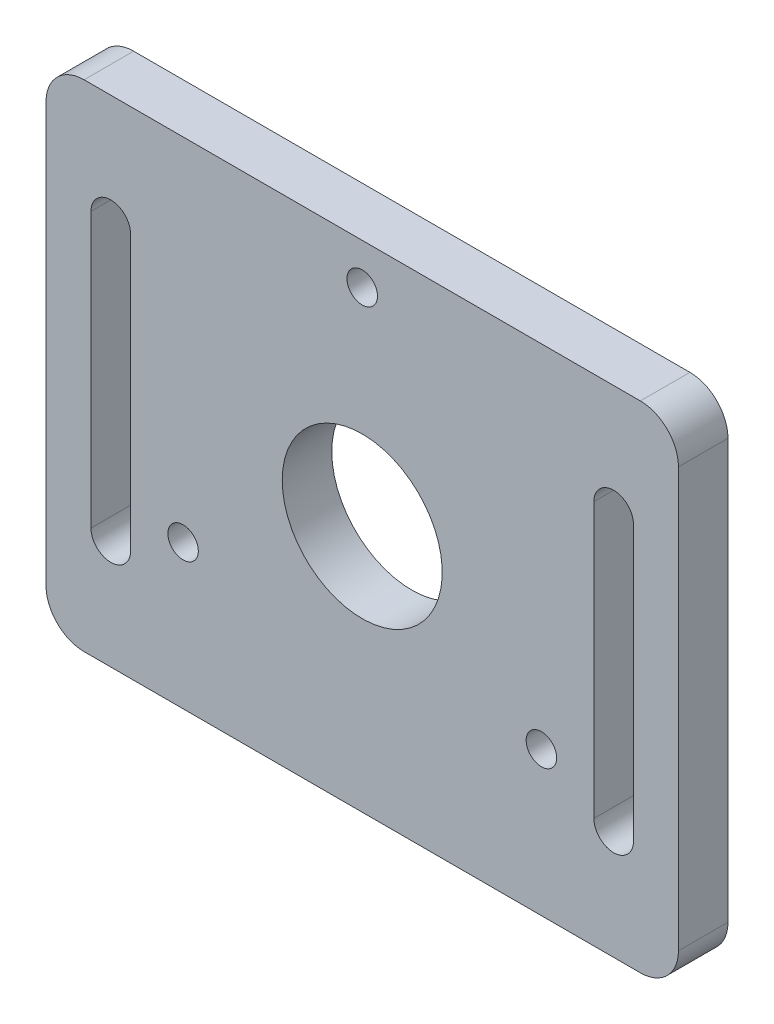
ISO-10303-21;
HEADER;
FILE_DESCRIPTION(('STEP AP214'),'2;1');
FILE_NAME('part.step','',(''),(''),'','','');
FILE_SCHEMA(('AUTOMOTIVE_DESIGN { 1 0 10303 214 1 1 1 1 }'));
ENDSEC;
DATA;
#1=APPLICATION_CONTEXT('core data for automotive mechanical design processes');
#2=APPLICATION_PROTOCOL_DEFINITION('international standard','automotive_design',2000,#1);
#3=PRODUCT_CONTEXT('',#1,'mechanical');
#4=PRODUCT('Part','Part','',(#3));
#5=PRODUCT_RELATED_PRODUCT_CATEGORY('part','',(#4));
#6=PRODUCT_DEFINITION_FORMATION('','',#4);
#7=PRODUCT_DEFINITION_CONTEXT('part definition',#1,'design');
#8=PRODUCT_DEFINITION('design','',#6,#7);
#9=PRODUCT_DEFINITION_SHAPE('','',#8);
#10=(LENGTH_UNIT() NAMED_UNIT(*) SI_UNIT(.MILLI.,.METRE.));
#11=(NAMED_UNIT(*) PLANE_ANGLE_UNIT() SI_UNIT($,.RADIAN.));
#12=(NAMED_UNIT(*) SI_UNIT($,.STERADIAN.) SOLID_ANGLE_UNIT());
#13=UNCERTAINTY_MEASURE_WITH_UNIT(LENGTH_MEASURE(1.E-05),#10,'distance_accuracy_value','');
#14=(GEOMETRIC_REPRESENTATION_CONTEXT(3) GLOBAL_UNCERTAINTY_ASSIGNED_CONTEXT((#13)) GLOBAL_UNIT_ASSIGNED_CONTEXT((#10,
#11,#12)) REPRESENTATION_CONTEXT('',''));
#15=CARTESIAN_POINT('',(0.,0.,0.));
#16=DIRECTION('',(0.,0.,1.));
#17=DIRECTION('',(1.,0.,0.));
#18=AXIS2_PLACEMENT_3D('',#15,#16,#17);
#19=CARTESIAN_POINT('',(-35.6,0.,6.5));
#20=DIRECTION('',(-1.,0.,0.));
#21=DIRECTION('',(0.,0.,1.));
#22=AXIS2_PLACEMENT_3D('',#19,#20,#21);
#23=PLANE('',#22);
#24=DIRECTION('',(0.,1.,0.));
#25=VECTOR('',#24,1.);
#26=CARTESIAN_POINT('',(-35.6,0.,0.));
#27=LINE('',#26,#25);
#28=CARTESIAN_POINT('',(-35.6,-18.,0.));
#29=VERTEX_POINT('',#28);
#30=CARTESIAN_POINT('',(-35.6,18.,0.));
#31=VERTEX_POINT('',#30);
#32=EDGE_CURVE('E237',#29,#31,#27,.T.);
#33=ORIENTED_EDGE('',*,*,#32,.T.);
#34=DIRECTION('',(0.,0.,-1.));
#35=VECTOR('',#34,1.);
#36=CARTESIAN_POINT('',(-35.6,18.,6.5));
#37=LINE('',#36,#35);
#38=CARTESIAN_POINT('',(-35.6,18.,6.5));
#39=VERTEX_POINT('',#38);
#40=EDGE_CURVE('E253',#39,#31,#37,.T.);
#41=ORIENTED_EDGE('',*,*,#40,.F.);
#42=DIRECTION('',(0.,1.,0.));
#43=VECTOR('',#42,1.);
#44=CARTESIAN_POINT('',(-35.6,0.,6.5));
#45=LINE('',#44,#43);
#46=CARTESIAN_POINT('',(-35.6,-18.,6.5));
#47=VERTEX_POINT('',#46);
#48=EDGE_CURVE('E202',#47,#39,#45,.T.);
#49=ORIENTED_EDGE('',*,*,#48,.F.);
#50=DIRECTION('',(0.,0.,-1.));
#51=VECTOR('',#50,1.);
#52=CARTESIAN_POINT('',(-35.6,-18.,6.5));
#53=LINE('',#52,#51);
#54=EDGE_CURVE('E167',#47,#29,#53,.T.);
#55=ORIENTED_EDGE('',*,*,#54,.T.);
#56=EDGE_LOOP('',(#33,#41,#49,#55));
#57=FACE_BOUND('',#56,.T.);
#58=ADVANCED_FACE('F41',(#57),#23,.F.);
#59=CARTESIAN_POINT('',(-33.,18.,6.5));
#60=DIRECTION('',(0.,0.,-1.));
#61=DIRECTION('',(-1.,0.,0.));
#62=AXIS2_PLACEMENT_3D('',#59,#60,#61);
#63=CYLINDRICAL_SURFACE('',#62,2.6);
#64=CARTESIAN_POINT('',(-33.,18.,0.));
#65=DIRECTION('',(0.,0.,1.));
#66=DIRECTION('',(1.,0.,0.));
#67=AXIS2_PLACEMENT_3D('',#64,#65,#66);
#68=CIRCLE('',#67,2.6);
#69=CARTESIAN_POINT('',(-30.4,18.,0.));
#70=VERTEX_POINT('',#69);
#71=EDGE_CURVE('E240',#31,#70,#68,.F.);
#72=ORIENTED_EDGE('',*,*,#71,.T.);
#73=DIRECTION('',(0.,0.,-1.));
#74=VECTOR('',#73,1.);
#75=CARTESIAN_POINT('',(-30.4,18.,6.5));
#76=LINE('',#75,#74);
#77=CARTESIAN_POINT('',(-30.4,18.,6.5));
#78=VERTEX_POINT('',#77);
#79=EDGE_CURVE('E251',#78,#70,#76,.T.);
#80=ORIENTED_EDGE('',*,*,#79,.F.);
#81=CARTESIAN_POINT('',(-33.,18.,6.5));
#82=DIRECTION('',(0.,0.,1.));
#83=DIRECTION('',(1.,0.,0.));
#84=AXIS2_PLACEMENT_3D('',#81,#82,#83);
#85=CIRCLE('',#84,2.6);
#86=EDGE_CURVE('E205',#39,#78,#85,.F.);
#87=ORIENTED_EDGE('',*,*,#86,.F.);
#88=ORIENTED_EDGE('',*,*,#40,.T.);
#89=EDGE_LOOP('',(#72,#80,#87,#88));
#90=FACE_BOUND('',#89,.T.);
#91=ADVANCED_FACE('F316',(#90),#63,.F.);
#92=CARTESIAN_POINT('',(-30.4,0.,6.5));
#93=DIRECTION('',(-1.,0.,0.));
#94=DIRECTION('',(0.,0.,1.));
#95=AXIS2_PLACEMENT_3D('',#92,#93,#94);
#96=PLANE('',#95);
#97=DIRECTION('',(0.,1.,0.));
#98=VECTOR('',#97,1.);
#99=CARTESIAN_POINT('',(-30.4,0.,0.));
#100=LINE('',#99,#98);
#101=CARTESIAN_POINT('',(-30.4,-18.,0.));
#102=VERTEX_POINT('',#101);
#103=EDGE_CURVE('E243',#102,#70,#100,.T.);
#104=ORIENTED_EDGE('',*,*,#103,.F.);
#105=DIRECTION('',(0.,0.,-1.));
#106=VECTOR('',#105,1.);
#107=CARTESIAN_POINT('',(-30.4,-18.,6.5));
#108=LINE('',#107,#106);
#109=CARTESIAN_POINT('',(-30.4,-18.,6.5));
#110=VERTEX_POINT('',#109);
#111=EDGE_CURVE('E249',#110,#102,#108,.T.);
#112=ORIENTED_EDGE('',*,*,#111,.F.);
#113=DIRECTION('',(0.,1.,0.));
#114=VECTOR('',#113,1.);
#115=CARTESIAN_POINT('',(-30.4,0.,6.5));
#116=LINE('',#115,#114);
#117=EDGE_CURVE('E207',#110,#78,#116,.T.);
#118=ORIENTED_EDGE('',*,*,#117,.T.);
#119=ORIENTED_EDGE('',*,*,#79,.T.);
#120=EDGE_LOOP('',(#104,#112,#118,#119));
#121=FACE_BOUND('',#120,.T.);
#122=ADVANCED_FACE('F322',(#121),#96,.T.);
#123=CARTESIAN_POINT('',(0.,-32.5,6.5));
#124=DIRECTION('',(0.,1.,0.));
#125=DIRECTION('',(-1.,0.,0.));
#126=AXIS2_PLACEMENT_3D('',#123,#124,#125);
#127=PLANE('',#126);
#128=DIRECTION('',(1.,0.,0.));
#129=VECTOR('',#128,1.);
#130=CARTESIAN_POINT('',(0.,-32.5,6.5));
#131=LINE('',#130,#129);
#132=CARTESIAN_POINT('',(-36.5,-32.5,6.5));
#133=VERTEX_POINT('',#132);
#134=CARTESIAN_POINT('',(36.5,-32.5,6.5));
#135=VERTEX_POINT('',#134);
#136=EDGE_CURVE('E192',#133,#135,#131,.T.);
#137=ORIENTED_EDGE('',*,*,#136,.F.);
#138=DIRECTION('',(0.,0.,-1.));
#139=VECTOR('',#138,1.);
#140=CARTESIAN_POINT('',(-36.5,-32.5,0.));
#141=LINE('',#140,#139);
#142=CARTESIAN_POINT('',(-36.5,-32.5,0.));
#143=VERTEX_POINT('',#142);
#144=EDGE_CURVE('E262',#133,#143,#141,.T.);
#145=ORIENTED_EDGE('',*,*,#144,.T.);
#146=DIRECTION('',(1.,0.,0.));
#147=VECTOR('',#146,1.);
#148=CARTESIAN_POINT('',(0.,-32.5,0.));
#149=LINE('',#148,#147);
#150=CARTESIAN_POINT('',(36.5,-32.5,0.));
#151=VERTEX_POINT('',#150);
#152=EDGE_CURVE('E225',#143,#151,#149,.T.);
#153=ORIENTED_EDGE('',*,*,#152,.T.);
#154=DIRECTION('',(0.,0.,-1.));
#155=VECTOR('',#154,1.);
#156=CARTESIAN_POINT('',(36.5,-32.5,6.5));
#157=LINE('',#156,#155);
#158=EDGE_CURVE('E256',#151,#135,#157,.F.);
#159=ORIENTED_EDGE('',*,*,#158,.T.);
#160=EDGE_LOOP('',(#137,#145,#153,#159));
#161=FACE_BOUND('',#160,.T.);
#162=ADVANCED_FACE('F339',(#161),#127,.F.);
#163=CARTESIAN_POINT('',(41.5,0.,6.5));
#164=DIRECTION('',(-1.,0.,0.));
#165=DIRECTION('',(0.,0.,1.));
#166=AXIS2_PLACEMENT_3D('',#163,#164,#165);
#167=PLANE('',#166);
#168=DIRECTION('',(0.,1.,0.));
#169=VECTOR('',#168,1.);
#170=CARTESIAN_POINT('',(41.5,0.,0.));
#171=LINE('',#170,#169);
#172=CARTESIAN_POINT('',(41.5,-27.5,0.));
#173=VERTEX_POINT('',#172);
#174=CARTESIAN_POINT('',(41.5,27.5,0.));
#175=VERTEX_POINT('',#174);
#176=EDGE_CURVE('E228',#173,#175,#171,.T.);
#177=ORIENTED_EDGE('',*,*,#176,.T.);
#178=DIRECTION('',(0.,0.,-1.));
#179=VECTOR('',#178,1.);
#180=CARTESIAN_POINT('',(41.5,27.5,6.5));
#181=LINE('',#180,#179);
#182=CARTESIAN_POINT('',(41.5,27.5,6.5));
#183=VERTEX_POINT('',#182);
#184=EDGE_CURVE('E11',#175,#183,#181,.F.);
#185=ORIENTED_EDGE('',*,*,#184,.T.);
#186=DIRECTION('',(0.,1.,0.));
#187=VECTOR('',#186,1.);
#188=CARTESIAN_POINT('',(41.5,0.,6.5));
#189=LINE('',#188,#187);
#190=CARTESIAN_POINT('',(41.5,-27.5,6.5));
#191=VERTEX_POINT('',#190);
#192=EDGE_CURVE('E195',#191,#183,#189,.T.);
#193=ORIENTED_EDGE('',*,*,#192,.F.);
#194=DIRECTION('',(0.,0.,-1.));
#195=VECTOR('',#194,1.);
#196=CARTESIAN_POINT('',(41.5,-27.5,6.5));
#197=LINE('',#196,#195);
#198=EDGE_CURVE('E50',#191,#173,#197,.T.);
#199=ORIENTED_EDGE('',*,*,#198,.T.);
#200=EDGE_LOOP('',(#177,#185,#193,#199));
#201=FACE_BOUND('',#200,.T.);
#202=ADVANCED_FACE('F336',(#201),#167,.F.);
#203=CARTESIAN_POINT('',(0.,32.5,6.5));
#204=DIRECTION('',(0.,1.,0.));
#205=DIRECTION('',(0.,0.,1.));
#206=AXIS2_PLACEMENT_3D('',#203,#204,#205);
#207=PLANE('',#206);
#208=DIRECTION('',(1.,0.,0.));
#209=VECTOR('',#208,1.);
#210=CARTESIAN_POINT('',(0.,32.5,0.));
#211=LINE('',#210,#209);
#212=CARTESIAN_POINT('',(-36.5,32.5,0.));
#213=VERTEX_POINT('',#212);
#214=CARTESIAN_POINT('',(36.5,32.5,0.));
#215=VERTEX_POINT('',#214);
#216=EDGE_CURVE('E231',#213,#215,#211,.T.);
#217=ORIENTED_EDGE('',*,*,#216,.F.);
#218=DIRECTION('',(0.,0.,-1.));
#219=VECTOR('',#218,1.);
#220=CARTESIAN_POINT('',(-36.5,32.5,6.5));
#221=LINE('',#220,#219);
#222=CARTESIAN_POINT('',(-36.5,32.5,6.5));
#223=VERTEX_POINT('',#222);
#224=EDGE_CURVE('E65',#213,#223,#221,.F.);
#225=ORIENTED_EDGE('',*,*,#224,.T.);
#226=DIRECTION('',(1.,0.,0.));
#227=VECTOR('',#226,1.);
#228=CARTESIAN_POINT('',(0.,32.5,6.5));
#229=LINE('',#228,#227);
#230=CARTESIAN_POINT('',(36.5,32.5,6.5));
#231=VERTEX_POINT('',#230);
#232=EDGE_CURVE('E197',#223,#231,#229,.T.);
#233=ORIENTED_EDGE('',*,*,#232,.T.);
#234=DIRECTION('',(0.,0.,-1.));
#235=VECTOR('',#234,1.);
#236=CARTESIAN_POINT('',(36.5,32.5,0.));
#237=LINE('',#236,#235);
#238=EDGE_CURVE('E285',#231,#215,#237,.T.);
#239=ORIENTED_EDGE('',*,*,#238,.T.);
#240=EDGE_LOOP('',(#217,#225,#233,#239));
#241=FACE_BOUND('',#240,.T.);
#242=ADVANCED_FACE('F333',(#241),#207,.T.);
#243=CARTESIAN_POINT('',(33.,18.,6.5));
#244=DIRECTION('',(0.,0.,-1.));
#245=DIRECTION('',(-1.,0.,0.));
#246=AXIS2_PLACEMENT_3D('',#243,#244,#245);
#247=CYLINDRICAL_SURFACE('',#246,2.6);
#248=CARTESIAN_POINT('',(33.,18.,0.));
#249=DIRECTION('',(0.,0.,1.));
#250=DIRECTION('',(1.,0.,0.));
#251=AXIS2_PLACEMENT_3D('',#248,#249,#250);
#252=CIRCLE('',#251,2.6);
#253=CARTESIAN_POINT('',(35.6,18.,0.));
#254=VERTEX_POINT('',#253);
#255=CARTESIAN_POINT('',(30.4,18.,0.));
#256=VERTEX_POINT('',#255);
#257=EDGE_CURVE('E162',#254,#256,#252,.T.);
#258=ORIENTED_EDGE('',*,*,#257,.F.);
#259=DIRECTION('',(0.,0.,-1.));
#260=VECTOR('',#259,1.);
#261=CARTESIAN_POINT('',(35.6,18.,6.5));
#262=LINE('',#261,#260);
#263=CARTESIAN_POINT('',(35.6,18.,6.5));
#264=VERTEX_POINT('',#263);
#265=EDGE_CURVE('E157',#264,#254,#262,.T.);
#266=ORIENTED_EDGE('',*,*,#265,.F.);
#267=CARTESIAN_POINT('',(33.,18.,6.5));
#268=DIRECTION('',(0.,0.,1.));
#269=DIRECTION('',(1.,0.,0.));
#270=AXIS2_PLACEMENT_3D('',#267,#268,#269);
#271=CIRCLE('',#270,2.6);
#272=CARTESIAN_POINT('',(30.4,18.,6.5));
#273=VERTEX_POINT('',#272);
#274=EDGE_CURVE('E160',#264,#273,#271,.T.);
#275=ORIENTED_EDGE('',*,*,#274,.T.);
#276=DIRECTION('',(0.,0.,-1.));
#277=VECTOR('',#276,1.);
#278=CARTESIAN_POINT('',(30.4,18.,6.5));
#279=LINE('',#278,#277);
#280=EDGE_CURVE('E212',#273,#256,#279,.T.);
#281=ORIENTED_EDGE('',*,*,#280,.T.);
#282=EDGE_LOOP('',(#258,#266,#275,#281));
#283=FACE_BOUND('',#282,.T.);
#284=ADVANCED_FACE('F159',(#283),#247,.F.);
#285=CARTESIAN_POINT('',(35.6,0.,6.5));
#286=DIRECTION('',(-1.,0.,0.));
#287=DIRECTION('',(0.,0.,1.));
#288=AXIS2_PLACEMENT_3D('',#285,#286,#287);
#289=PLANE('',#288);
#290=DIRECTION('',(0.,1.,0.));
#291=VECTOR('',#290,1.);
#292=CARTESIAN_POINT('',(35.6,0.,0.));
#293=LINE('',#292,#291);
#294=CARTESIAN_POINT('',(35.6,-18.,0.));
#295=VERTEX_POINT('',#294);
#296=EDGE_CURVE('E214',#295,#254,#293,.T.);
#297=ORIENTED_EDGE('',*,*,#296,.F.);
#298=DIRECTION('',(0.,0.,-1.));
#299=VECTOR('',#298,1.);
#300=CARTESIAN_POINT('',(35.6,-18.,6.5));
#301=LINE('',#300,#299);
#302=CARTESIAN_POINT('',(35.6,-18.,6.5));
#303=VERTEX_POINT('',#302);
#304=EDGE_CURVE('E168',#303,#295,#301,.T.);
#305=ORIENTED_EDGE('',*,*,#304,.F.);
#306=DIRECTION('',(0.,1.,0.));
#307=VECTOR('',#306,1.);
#308=CARTESIAN_POINT('',(35.6,0.,6.5));
#309=LINE('',#308,#307);
#310=EDGE_CURVE('E175',#303,#264,#309,.T.);
#311=ORIENTED_EDGE('',*,*,#310,.T.);
#312=ORIENTED_EDGE('',*,*,#265,.T.);
#313=EDGE_LOOP('',(#297,#305,#311,#312));
#314=FACE_BOUND('',#313,.T.);
#315=ADVANCED_FACE('F182',(#314),#289,.T.);
#316=CARTESIAN_POINT('',(33.,-18.,6.5));
#317=DIRECTION('',(0.,0.,-1.));
#318=DIRECTION('',(-1.,0.,0.));
#319=AXIS2_PLACEMENT_3D('',#316,#317,#318);
#320=CYLINDRICAL_SURFACE('',#319,2.6);
#321=CARTESIAN_POINT('',(33.,-18.,0.));
#322=DIRECTION('',(0.,0.,1.));
#323=DIRECTION('',(1.,0.,0.));
#324=AXIS2_PLACEMENT_3D('',#321,#322,#323);
#325=CIRCLE('',#324,2.6);
#326=CARTESIAN_POINT('',(30.4,-18.,0.));
#327=VERTEX_POINT('',#326);
#328=EDGE_CURVE('E216',#327,#295,#325,.T.);
#329=ORIENTED_EDGE('',*,*,#328,.F.);
#330=DIRECTION('',(0.,0.,-1.));
#331=VECTOR('',#330,1.);
#332=CARTESIAN_POINT('',(30.4,-18.,6.5));
#333=LINE('',#332,#331);
#334=CARTESIAN_POINT('',(30.4,-18.,6.5));
#335=VERTEX_POINT('',#334);
#336=EDGE_CURVE('E258',#335,#327,#333,.T.);
#337=ORIENTED_EDGE('',*,*,#336,.F.);
#338=CARTESIAN_POINT('',(33.,-18.,6.5));
#339=DIRECTION('',(0.,0.,1.));
#340=DIRECTION('',(1.,0.,0.));
#341=AXIS2_PLACEMENT_3D('',#338,#339,#340);
#342=CIRCLE('',#341,2.6);
#343=EDGE_CURVE('E183',#335,#303,#342,.T.);
#344=ORIENTED_EDGE('',*,*,#343,.T.);
#345=ORIENTED_EDGE('',*,*,#304,.T.);
#346=EDGE_LOOP('',(#329,#337,#344,#345));
#347=FACE_BOUND('',#346,.T.);
#348=ADVANCED_FACE('F331',(#347),#320,.F.);
#349=CARTESIAN_POINT('',(-41.5,0.,6.5));
#350=DIRECTION('',(-1.,0.,0.));
#351=DIRECTION('',(0.,0.,1.));
#352=AXIS2_PLACEMENT_3D('',#349,#350,#351);
#353=PLANE('',#352);
#354=DIRECTION('',(0.,1.,0.));
#355=VECTOR('',#354,1.);
#356=CARTESIAN_POINT('',(-41.5,0.,0.));
#357=LINE('',#356,#355);
#358=CARTESIAN_POINT('',(-41.5,-27.5,0.));
#359=VERTEX_POINT('',#358);
#360=CARTESIAN_POINT('',(-41.5,27.5,0.));
#361=VERTEX_POINT('',#360);
#362=EDGE_CURVE('E234',#359,#361,#357,.T.);
#363=ORIENTED_EDGE('',*,*,#362,.F.);
#364=DIRECTION('',(0.,0.,-1.));
#365=VECTOR('',#364,1.);
#366=CARTESIAN_POINT('',(-41.5,-27.5,6.5));
#367=LINE('',#366,#365);
#368=CARTESIAN_POINT('',(-41.5,-27.5,6.5));
#369=VERTEX_POINT('',#368);
#370=EDGE_CURVE('E276',#359,#369,#367,.F.);
#371=ORIENTED_EDGE('',*,*,#370,.T.);
#372=DIRECTION('',(0.,1.,0.));
#373=VECTOR('',#372,1.);
#374=CARTESIAN_POINT('',(-41.5,0.,6.5));
#375=LINE('',#374,#373);
#376=CARTESIAN_POINT('',(-41.5,27.5,6.5));
#377=VERTEX_POINT('',#376);
#378=EDGE_CURVE('E199',#369,#377,#375,.T.);
#379=ORIENTED_EDGE('',*,*,#378,.T.);
#380=DIRECTION('',(0.,0.,-1.));
#381=VECTOR('',#380,1.);
#382=CARTESIAN_POINT('',(-41.5,27.5,6.5));
#383=LINE('',#382,#381);
#384=EDGE_CURVE('E273',#377,#361,#383,.T.);
#385=ORIENTED_EDGE('',*,*,#384,.T.);
#386=EDGE_LOOP('',(#363,#371,#379,#385));
#387=FACE_BOUND('',#386,.T.);
#388=ADVANCED_FACE('F327',(#387),#353,.T.);
#389=CARTESIAN_POINT('',(0.,0.,6.5));
#390=DIRECTION('',(0.,0.,-1.));
#391=DIRECTION('',(-1.,0.,0.));
#392=AXIS2_PLACEMENT_3D('',#389,#390,#391);
#393=CYLINDRICAL_SURFACE('',#392,10.5);
#394=CARTESIAN_POINT('',(0.,0.,6.5));
#395=DIRECTION('',(0.,0.,1.));
#396=DIRECTION('',(1.,0.,0.));
#397=AXIS2_PLACEMENT_3D('',#394,#395,#396);
#398=CIRCLE('',#397,10.5);
#399=CARTESIAN_POINT('',(-10.5,0.,6.5));
#400=VERTEX_POINT('',#399);
#401=EDGE_CURVE('E189',#400,#400,#398,.T.);
#402=CARTESIAN_POINT('',(0.,0.,0.));
#403=DIRECTION('',(0.,0.,1.));
#404=DIRECTION('',(1.,0.,0.));
#405=AXIS2_PLACEMENT_3D('',#402,#403,#404);
#406=CIRCLE('',#405,10.5);
#407=CARTESIAN_POINT('',(-10.5,0.,0.));
#408=VERTEX_POINT('',#407);
#409=EDGE_CURVE('E222',#408,#408,#406,.T.);
#410=CARTESIAN_POINT('',(-10.5,0.,6.5));
#411=CARTESIAN_POINT('',(-10.5,0.,6.43229166666667));
#412=CARTESIAN_POINT('',(-10.5,0.,6.36458333333333));
#413=CARTESIAN_POINT('',(-10.5,0.,6.22916666666667));
#414=CARTESIAN_POINT('',(-10.5,0.,6.16145833333333));
#415=CARTESIAN_POINT('',(-10.5,0.,6.02604166666667));
#416=CARTESIAN_POINT('',(-10.5,0.,5.95833333333333));
#417=CARTESIAN_POINT('',(-10.5,0.,5.82291666666667));
#418=CARTESIAN_POINT('',(-10.5,0.,5.75520833333333));
#419=CARTESIAN_POINT('',(-10.5,0.,5.61979166666667));
#420=CARTESIAN_POINT('',(-10.5,0.,5.55208333333333));
#421=CARTESIAN_POINT('',(-10.5,0.,5.41666666666667));
#422=CARTESIAN_POINT('',(-10.5,0.,5.34895833333333));
#423=CARTESIAN_POINT('',(-10.5,0.,5.21354166666667));
#424=CARTESIAN_POINT('',(-10.5,0.,5.14583333333333));
#425=CARTESIAN_POINT('',(-10.5,0.,5.01041666666667));
#426=CARTESIAN_POINT('',(-10.5,0.,4.94270833333333));
#427=CARTESIAN_POINT('',(-10.5,0.,4.80729166666667));
#428=CARTESIAN_POINT('',(-10.5,0.,4.73958333333333));
#429=CARTESIAN_POINT('',(-10.5,0.,4.60416666666667));
#430=CARTESIAN_POINT('',(-10.5,0.,4.53645833333333));
#431=CARTESIAN_POINT('',(-10.5,0.,4.40104166666667));
#432=CARTESIAN_POINT('',(-10.5,0.,4.33333333333333));
#433=CARTESIAN_POINT('',(-10.5,0.,4.19791666666667));
#434=CARTESIAN_POINT('',(-10.5,0.,4.13020833333333));
#435=CARTESIAN_POINT('',(-10.5,0.,3.99479166666667));
#436=CARTESIAN_POINT('',(-10.5,0.,3.92708333333333));
#437=CARTESIAN_POINT('',(-10.5,0.,3.79166666666667));
#438=CARTESIAN_POINT('',(-10.5,0.,3.72395833333333));
#439=CARTESIAN_POINT('',(-10.5,0.,3.58854166666667));
#440=CARTESIAN_POINT('',(-10.5,0.,3.52083333333333));
#441=CARTESIAN_POINT('',(-10.5,0.,3.38541666666667));
#442=CARTESIAN_POINT('',(-10.5,0.,3.31770833333333));
#443=CARTESIAN_POINT('',(-10.5,0.,3.18229166666667));
#444=CARTESIAN_POINT('',(-10.5,0.,3.11458333333333));
#445=CARTESIAN_POINT('',(-10.5,0.,2.97916666666667));
#446=CARTESIAN_POINT('',(-10.5,0.,2.91145833333333));
#447=CARTESIAN_POINT('',(-10.5,0.,2.77604166666667));
#448=CARTESIAN_POINT('',(-10.5,0.,2.70833333333333));
#449=CARTESIAN_POINT('',(-10.5,0.,2.57291666666667));
#450=CARTESIAN_POINT('',(-10.5,0.,2.50520833333333));
#451=CARTESIAN_POINT('',(-10.5,0.,2.36979166666667));
#452=CARTESIAN_POINT('',(-10.5,0.,2.30208333333333));
#453=CARTESIAN_POINT('',(-10.5,0.,2.16666666666667));
#454=CARTESIAN_POINT('',(-10.5,0.,2.09895833333333));
#455=CARTESIAN_POINT('',(-10.5,0.,1.96354166666667));
#456=CARTESIAN_POINT('',(-10.5,0.,1.89583333333333));
#457=CARTESIAN_POINT('',(-10.5,0.,1.76041666666667));
#458=CARTESIAN_POINT('',(-10.5,0.,1.69270833333333));
#459=CARTESIAN_POINT('',(-10.5,0.,1.55729166666667));
#460=CARTESIAN_POINT('',(-10.5,0.,1.48958333333333));
#461=CARTESIAN_POINT('',(-10.5,0.,1.35416666666667));
#462=CARTESIAN_POINT('',(-10.5,0.,1.28645833333333));
#463=CARTESIAN_POINT('',(-10.5,0.,1.15104166666667));
#464=CARTESIAN_POINT('',(-10.5,0.,1.08333333333333));
#465=CARTESIAN_POINT('',(-10.5,0.,0.947916666666667));
#466=CARTESIAN_POINT('',(-10.5,0.,0.880208333333333));
#467=CARTESIAN_POINT('',(-10.5,0.,0.744791666666667));
#468=CARTESIAN_POINT('',(-10.5,0.,0.677083333333333));
#469=CARTESIAN_POINT('',(-10.5,0.,0.541666666666667));
#470=CARTESIAN_POINT('',(-10.5,0.,0.473958333333333));
#471=CARTESIAN_POINT('',(-10.5,0.,0.338541666666667));
#472=CARTESIAN_POINT('',(-10.5,0.,0.270833333333334));
#473=CARTESIAN_POINT('',(-10.5,0.,0.135416666666667));
#474=CARTESIAN_POINT('',(-10.5,0.,0.0677083333333334));
#475=CARTESIAN_POINT('',(-10.5,0.,0.));
#476=B_SPLINE_CURVE_WITH_KNOTS('',3,(#410,#411,#412,#413,#414,#415,#416,#417,#418,#419,#420,
#421,#422,#423,#424,#425,#426,#427,#428,#429,#430,#431,#432,#433,#434,#435,#436,#437,#438,#439,
#440,#441,#442,#443,#444,#445,#446,#447,#448,#449,#450,#451,#452,#453,#454,#455,#456,#457,#458,
#459,#460,#461,#462,#463,#464,#465,#466,#467,#468,#469,#470,#471,#472,#473,#474,#475),
.UNSPECIFIED.,.F.,.F.,(4,2,2,2,2,2,2,2,2,2,2,2,2,2,2,2,2,2,2,2,2,2,2,2,2,2,2,2,2,2,2,2,4),(0.,
0.203124999999999,0.40625,0.609375,0.812499999999999,1.015625,1.21875,1.421875,1.625,1.828125,
2.03125,2.234375,2.4375,2.640625,2.84375,3.046875,3.25,3.453125,3.65625,3.859375,4.0625,
4.265625,4.46875,4.671875,4.875,5.078125,5.28125,5.484375,5.6875,5.890625,6.09375,6.296875,6.5),.UNSPECIFIED.);
#477=EDGE_CURVE('BSEAM330',#400,#408,#476,.T.);
#478=ORIENTED_EDGE('',*,*,#401,.T.);
#479=ORIENTED_EDGE('',*,*,#409,.F.);
#480=ORIENTED_EDGE('',*,*,#477,.T.);
#481=ORIENTED_EDGE('',*,*,#477,.F.);
#482=EDGE_LOOP('',(#478,#480,#479,#481));
#483=FACE_BOUND('',#482,.T.);
#484=ADVANCED_FACE('F330',(#483),#393,.F.);
#485=CARTESIAN_POINT('',(30.4,0.,6.5));
#486=DIRECTION('',(-1.,0.,0.));
#487=DIRECTION('',(0.,0.,1.));
#488=AXIS2_PLACEMENT_3D('',#485,#486,#487);
#489=PLANE('',#488);
#490=DIRECTION('',(0.,1.,0.));
#491=VECTOR('',#490,1.);
#492=CARTESIAN_POINT('',(30.4,0.,0.));
#493=LINE('',#492,#491);
#494=EDGE_CURVE('E219',#327,#256,#493,.T.);
#495=ORIENTED_EDGE('',*,*,#494,.T.);
#496=ORIENTED_EDGE('',*,*,#280,.F.);
#497=DIRECTION('',(0.,1.,0.));
#498=VECTOR('',#497,1.);
#499=CARTESIAN_POINT('',(30.4,0.,6.5));
#500=LINE('',#499,#498);
#501=EDGE_CURVE('E178',#335,#273,#500,.T.);
#502=ORIENTED_EDGE('',*,*,#501,.F.);
#503=ORIENTED_EDGE('',*,*,#336,.T.);
#504=EDGE_LOOP('',(#495,#496,#502,#503));
#505=FACE_BOUND('',#504,.T.);
#506=ADVANCED_FACE('F346',(#505),#489,.F.);
#507=CARTESIAN_POINT('',(-33.,-18.,6.5));
#508=DIRECTION('',(0.,0.,-1.));
#509=DIRECTION('',(-1.,0.,0.));
#510=AXIS2_PLACEMENT_3D('',#507,#508,#509);
#511=CYLINDRICAL_SURFACE('',#510,2.6);
#512=CARTESIAN_POINT('',(-33.,-18.,0.));
#513=DIRECTION('',(0.,0.,1.));
#514=DIRECTION('',(1.,0.,0.));
#515=AXIS2_PLACEMENT_3D('',#512,#513,#514);
#516=CIRCLE('',#515,2.6);
#517=EDGE_CURVE('E180',#102,#29,#516,.F.);
#518=ORIENTED_EDGE('',*,*,#517,.T.);
#519=ORIENTED_EDGE('',*,*,#54,.F.);
#520=CARTESIAN_POINT('',(-33.,-18.,6.5));
#521=DIRECTION('',(0.,0.,1.));
#522=DIRECTION('',(1.,0.,0.));
#523=AXIS2_PLACEMENT_3D('',#520,#521,#522);
#524=CIRCLE('',#523,2.6);
#525=EDGE_CURVE('E210',#110,#47,#524,.F.);
#526=ORIENTED_EDGE('',*,*,#525,.F.);
#527=ORIENTED_EDGE('',*,*,#111,.T.);
#528=EDGE_LOOP('',(#518,#519,#526,#527));
#529=FACE_BOUND('',#528,.T.);
#530=ADVANCED_FACE('F350',(#529),#511,.F.);
#531=CARTESIAN_POINT('',(0.,0.,6.5));
#532=DIRECTION('',(0.,0.,1.));
#533=DIRECTION('',(1.,0.,0.));
#534=AXIS2_PLACEMENT_3D('',#531,#532,#533);
#535=PLANE('',#534);
#536=CARTESIAN_POINT('',(0.,27.15,6.5));
#537=DIRECTION('',(0.,0.,1.));
#538=DIRECTION('',(1.,0.,0.));
#539=AXIS2_PLACEMENT_3D('',#536,#537,#538);
#540=CIRCLE('',#539,2.);
#541=CARTESIAN_POINT('',(2.,27.15,6.5));
#542=VERTEX_POINT('',#541);
#543=EDGE_CURVE('E294',#542,#542,#540,.T.);
#544=ORIENTED_EDGE('',*,*,#543,.F.);
#545=EDGE_LOOP('',(#544));
#546=FACE_BOUND('',#545,.T.);
#547=CARTESIAN_POINT('',(23.5125897127472,-13.575,6.5));
#548=DIRECTION('',(0.,0.,1.));
#549=DIRECTION('',(1.,0.,0.));
#550=AXIS2_PLACEMENT_3D('',#547,#548,#549);
#551=CIRCLE('',#550,2.);
#552=CARTESIAN_POINT('',(25.5125897127473,-13.575,6.5));
#553=VERTEX_POINT('',#552);
#554=EDGE_CURVE('E524',#553,#553,#551,.T.);
#555=ORIENTED_EDGE('',*,*,#554,.F.);
#556=EDGE_LOOP('',(#555));
#557=FACE_BOUND('',#556,.T.);
#558=CARTESIAN_POINT('',(-23.5125897127476,-13.5749999999998,6.5));
#559=DIRECTION('',(0.,0.,1.));
#560=DIRECTION('',(1.,0.,0.));
#561=AXIS2_PLACEMENT_3D('',#558,#559,#560);
#562=CIRCLE('',#561,2.);
#563=CARTESIAN_POINT('',(-21.5125897127476,-13.5749999999998,6.5));
#564=VERTEX_POINT('',#563);
#565=EDGE_CURVE('E514',#564,#564,#562,.T.);
#566=ORIENTED_EDGE('',*,*,#565,.F.);
#567=EDGE_LOOP('',(#566));
#568=FACE_BOUND('',#567,.T.);
#569=ORIENTED_EDGE('',*,*,#274,.F.);
#570=ORIENTED_EDGE('',*,*,#310,.F.);
#571=ORIENTED_EDGE('',*,*,#343,.F.);
#572=ORIENTED_EDGE('',*,*,#501,.T.);
#573=EDGE_LOOP('',(#569,#570,#571,#572));
#574=FACE_BOUND('',#573,.T.);
#575=ORIENTED_EDGE('',*,*,#401,.F.);
#576=EDGE_LOOP('',(#575));
#577=FACE_BOUND('',#576,.T.);
#578=ORIENTED_EDGE('',*,*,#378,.F.);
#579=CARTESIAN_POINT('',(-36.5,-27.5,6.5));
#580=DIRECTION('',(0.,0.,1.));
#581=DIRECTION('',(1.,0.,0.));
#582=AXIS2_PLACEMENT_3D('',#579,#580,#581);
#583=CIRCLE('',#582,5.);
#584=EDGE_CURVE('E283',#369,#133,#583,.T.);
#585=ORIENTED_EDGE('',*,*,#584,.T.);
#586=ORIENTED_EDGE('',*,*,#136,.T.);
#587=CARTESIAN_POINT('',(36.5,-27.5,6.5));
#588=DIRECTION('',(0.,0.,1.));
#589=DIRECTION('',(1.,0.,0.));
#590=AXIS2_PLACEMENT_3D('',#587,#588,#589);
#591=CIRCLE('',#590,5.);
#592=EDGE_CURVE('E278',#135,#191,#591,.T.);
#593=ORIENTED_EDGE('',*,*,#592,.T.);
#594=ORIENTED_EDGE('',*,*,#192,.T.);
#595=CARTESIAN_POINT('',(36.5,27.5,6.5));
#596=DIRECTION('',(0.,0.,1.));
#597=DIRECTION('',(1.,0.,0.));
#598=AXIS2_PLACEMENT_3D('',#595,#596,#597);
#599=CIRCLE('',#598,5.);
#600=EDGE_CURVE('E58',#183,#231,#599,.T.);
#601=ORIENTED_EDGE('',*,*,#600,.T.);
#602=ORIENTED_EDGE('',*,*,#232,.F.);
#603=CARTESIAN_POINT('',(-36.5,27.5,6.5));
#604=DIRECTION('',(0.,0.,1.));
#605=DIRECTION('',(1.,0.,0.));
#606=AXIS2_PLACEMENT_3D('',#603,#604,#605);
#607=CIRCLE('',#606,5.);
#608=EDGE_CURVE('E281',#223,#377,#607,.T.);
#609=ORIENTED_EDGE('',*,*,#608,.T.);
#610=EDGE_LOOP('',(#578,#585,#586,#593,#594,#601,#602,#609));
#611=FACE_BOUND('',#610,.T.);
#612=ORIENTED_EDGE('',*,*,#48,.T.);
#613=ORIENTED_EDGE('',*,*,#86,.T.);
#614=ORIENTED_EDGE('',*,*,#117,.F.);
#615=ORIENTED_EDGE('',*,*,#525,.T.);
#616=EDGE_LOOP('',(#612,#613,#614,#615));
#617=FACE_BOUND('',#616,.T.);
#618=ADVANCED_FACE('F172',(#546,#557,#568,#574,#577,#611,#617),#535,.T.);
#619=CARTESIAN_POINT('',(0.,0.,0.));
#620=DIRECTION('',(0.,0.,1.));
#621=DIRECTION('',(1.,0.,0.));
#622=AXIS2_PLACEMENT_3D('',#619,#620,#621);
#623=PLANE('',#622);
#624=CARTESIAN_POINT('',(0.,27.15,0.));
#625=DIRECTION('',(0.,0.,1.));
#626=DIRECTION('',(1.,0.,0.));
#627=AXIS2_PLACEMENT_3D('',#624,#625,#626);
#628=CIRCLE('',#627,2.);
#629=CARTESIAN_POINT('',(2.,27.15,0.));
#630=VERTEX_POINT('',#629);
#631=EDGE_CURVE('E45',#630,#630,#628,.T.);
#632=ORIENTED_EDGE('',*,*,#631,.T.);
#633=EDGE_LOOP('',(#632));
#634=FACE_BOUND('',#633,.T.);
#635=CARTESIAN_POINT('',(23.5125897127472,-13.575,0.));
#636=DIRECTION('',(0.,0.,1.));
#637=DIRECTION('',(1.,0.,0.));
#638=AXIS2_PLACEMENT_3D('',#635,#636,#637);
#639=CIRCLE('',#638,2.);
#640=CARTESIAN_POINT('',(25.5125897127473,-13.575,0.));
#641=VERTEX_POINT('',#640);
#642=EDGE_CURVE('E293',#641,#641,#639,.T.);
#643=ORIENTED_EDGE('',*,*,#642,.T.);
#644=EDGE_LOOP('',(#643));
#645=FACE_BOUND('',#644,.T.);
#646=CARTESIAN_POINT('',(-23.5125897127476,-13.5749999999998,0.));
#647=DIRECTION('',(0.,0.,1.));
#648=DIRECTION('',(1.,0.,0.));
#649=AXIS2_PLACEMENT_3D('',#646,#647,#648);
#650=CIRCLE('',#649,2.);
#651=CARTESIAN_POINT('',(-21.5125897127476,-13.5749999999998,0.));
#652=VERTEX_POINT('',#651);
#653=EDGE_CURVE('E291',#652,#652,#650,.T.);
#654=ORIENTED_EDGE('',*,*,#653,.T.);
#655=EDGE_LOOP('',(#654));
#656=FACE_BOUND('',#655,.T.);
#657=ORIENTED_EDGE('',*,*,#257,.T.);
#658=ORIENTED_EDGE('',*,*,#494,.F.);
#659=ORIENTED_EDGE('',*,*,#328,.T.);
#660=ORIENTED_EDGE('',*,*,#296,.T.);
#661=EDGE_LOOP('',(#657,#658,#659,#660));
#662=FACE_BOUND('',#661,.T.);
#663=ORIENTED_EDGE('',*,*,#409,.T.);
#664=EDGE_LOOP('',(#663));
#665=FACE_BOUND('',#664,.T.);
#666=ORIENTED_EDGE('',*,*,#152,.F.);
#667=CARTESIAN_POINT('',(-36.5,-27.5,0.));
#668=DIRECTION('',(0.,0.,1.));
#669=DIRECTION('',(1.,0.,0.));
#670=AXIS2_PLACEMENT_3D('',#667,#668,#669);
#671=CIRCLE('',#670,5.);
#672=EDGE_CURVE('E271',#143,#359,#671,.F.);
#673=ORIENTED_EDGE('',*,*,#672,.T.);
#674=ORIENTED_EDGE('',*,*,#362,.T.);
#675=CARTESIAN_POINT('',(-36.5,27.5,0.));
#676=DIRECTION('',(0.,0.,1.));
#677=DIRECTION('',(1.,0.,0.));
#678=AXIS2_PLACEMENT_3D('',#675,#676,#677);
#679=CIRCLE('',#678,5.);
#680=EDGE_CURVE('E269',#361,#213,#679,.F.);
#681=ORIENTED_EDGE('',*,*,#680,.T.);
#682=ORIENTED_EDGE('',*,*,#216,.T.);
#683=CARTESIAN_POINT('',(36.5,27.5,0.));
#684=DIRECTION('',(0.,0.,1.));
#685=DIRECTION('',(1.,0.,0.));
#686=AXIS2_PLACEMENT_3D('',#683,#684,#685);
#687=CIRCLE('',#686,5.);
#688=EDGE_CURVE('E267',#215,#175,#687,.F.);
#689=ORIENTED_EDGE('',*,*,#688,.T.);
#690=ORIENTED_EDGE('',*,*,#176,.F.);
#691=CARTESIAN_POINT('',(36.5,-27.5,0.));
#692=DIRECTION('',(0.,0.,1.));
#693=DIRECTION('',(1.,0.,0.));
#694=AXIS2_PLACEMENT_3D('',#691,#692,#693);
#695=CIRCLE('',#694,5.);
#696=EDGE_CURVE('E265',#173,#151,#695,.F.);
#697=ORIENTED_EDGE('',*,*,#696,.T.);
#698=EDGE_LOOP('',(#666,#673,#674,#681,#682,#689,#690,#697));
#699=FACE_BOUND('',#698,.T.);
#700=ORIENTED_EDGE('',*,*,#32,.F.);
#701=ORIENTED_EDGE('',*,*,#517,.F.);
#702=ORIENTED_EDGE('',*,*,#103,.T.);
#703=ORIENTED_EDGE('',*,*,#71,.F.);
#704=EDGE_LOOP('',(#700,#701,#702,#703));
#705=FACE_BOUND('',#704,.T.);
#706=ADVANCED_FACE('F301',(#634,#645,#656,#662,#665,#699,#705),#623,.F.);
#707=CARTESIAN_POINT('',(-36.5,-27.5,6.5));
#708=DIRECTION('',(0.,0.,1.));
#709=DIRECTION('',(1.,0.,0.));
#710=AXIS2_PLACEMENT_3D('',#707,#708,#709);
#711=CYLINDRICAL_SURFACE('',#710,5.);
#712=ORIENTED_EDGE('',*,*,#584,.F.);
#713=ORIENTED_EDGE('',*,*,#370,.F.);
#714=ORIENTED_EDGE('',*,*,#672,.F.);
#715=ORIENTED_EDGE('',*,*,#144,.F.);
#716=EDGE_LOOP('',(#712,#713,#714,#715));
#717=FACE_BOUND('',#716,.T.);
#718=ADVANCED_FACE('F359',(#717),#711,.T.);
#719=CARTESIAN_POINT('',(-36.5,27.5,6.5));
#720=DIRECTION('',(0.,0.,-1.));
#721=DIRECTION('',(-1.,0.,0.));
#722=AXIS2_PLACEMENT_3D('',#719,#720,#721);
#723=CYLINDRICAL_SURFACE('',#722,5.);
#724=ORIENTED_EDGE('',*,*,#608,.F.);
#725=ORIENTED_EDGE('',*,*,#224,.F.);
#726=ORIENTED_EDGE('',*,*,#680,.F.);
#727=ORIENTED_EDGE('',*,*,#384,.F.);
#728=EDGE_LOOP('',(#724,#725,#726,#727));
#729=FACE_BOUND('',#728,.T.);
#730=ADVANCED_FACE('F362',(#729),#723,.T.);
#731=CARTESIAN_POINT('',(36.5,27.5,6.5));
#732=DIRECTION('',(0.,0.,1.));
#733=DIRECTION('',(1.,0.,0.));
#734=AXIS2_PLACEMENT_3D('',#731,#732,#733);
#735=CYLINDRICAL_SURFACE('',#734,5.);
#736=ORIENTED_EDGE('',*,*,#600,.F.);
#737=ORIENTED_EDGE('',*,*,#184,.F.);
#738=ORIENTED_EDGE('',*,*,#688,.F.);
#739=ORIENTED_EDGE('',*,*,#238,.F.);
#740=EDGE_LOOP('',(#736,#737,#738,#739));
#741=FACE_BOUND('',#740,.T.);
#742=ADVANCED_FACE('F365',(#741),#735,.T.);
#743=CARTESIAN_POINT('',(36.5,-27.5,6.5));
#744=DIRECTION('',(0.,0.,-1.));
#745=DIRECTION('',(-1.,0.,0.));
#746=AXIS2_PLACEMENT_3D('',#743,#744,#745);
#747=CYLINDRICAL_SURFACE('',#746,5.);
#748=ORIENTED_EDGE('',*,*,#592,.F.);
#749=ORIENTED_EDGE('',*,*,#158,.F.);
#750=ORIENTED_EDGE('',*,*,#696,.F.);
#751=ORIENTED_EDGE('',*,*,#198,.F.);
#752=EDGE_LOOP('',(#748,#749,#750,#751));
#753=FACE_BOUND('',#752,.T.);
#754=ADVANCED_FACE('F43',(#753),#747,.T.);
#755=CARTESIAN_POINT('',(-23.5125897127476,-13.5749999999998,-3.5));
#756=DIRECTION('',(0.,0.,1.));
#757=DIRECTION('',(1.,0.,0.));
#758=AXIS2_PLACEMENT_3D('',#755,#756,#757);
#759=CYLINDRICAL_SURFACE('',#758,2.);
#760=ORIENTED_EDGE('',*,*,#565,.T.);
#761=EDGE_LOOP('',(#760));
#762=FACE_BOUND('',#761,.T.);
#763=ORIENTED_EDGE('',*,*,#653,.F.);
#764=EDGE_LOOP('',(#763));
#765=FACE_BOUND('',#764,.T.);
#766=ADVANCED_FACE('F311',(#762,#765),#759,.F.);
#767=CARTESIAN_POINT('',(23.5125897127472,-13.575,-3.5));
#768=DIRECTION('',(0.,0.,1.));
#769=DIRECTION('',(1.,0.,0.));
#770=AXIS2_PLACEMENT_3D('',#767,#768,#769);
#771=CYLINDRICAL_SURFACE('',#770,2.);
#772=ORIENTED_EDGE('',*,*,#554,.T.);
#773=EDGE_LOOP('',(#772));
#774=FACE_BOUND('',#773,.T.);
#775=ORIENTED_EDGE('',*,*,#642,.F.);
#776=EDGE_LOOP('',(#775));
#777=FACE_BOUND('',#776,.T.);
#778=ADVANCED_FACE('F305',(#774,#777),#771,.F.);
#779=CARTESIAN_POINT('',(0.,27.15,-3.5));
#780=DIRECTION('',(0.,0.,1.));
#781=DIRECTION('',(1.,0.,0.));
#782=AXIS2_PLACEMENT_3D('',#779,#780,#781);
#783=CYLINDRICAL_SURFACE('',#782,2.);
#784=ORIENTED_EDGE('',*,*,#543,.T.);
#785=EDGE_LOOP('',(#784));
#786=FACE_BOUND('',#785,.T.);
#787=ORIENTED_EDGE('',*,*,#631,.F.);
#788=EDGE_LOOP('',(#787));
#789=FACE_BOUND('',#788,.T.);
#790=ADVANCED_FACE('F303',(#786,#789),#783,.F.);
#791=CLOSED_SHELL('',(#58,#91,#122,#162,#202,#242,#284,#315,#348,#388,#484,#506,#530,#618,#706,
#718,#730,#742,#754,#766,#778,#790));
#792=MANIFOLD_SOLID_BREP('B2',#791);
#793=ADVANCED_BREP_SHAPE_REPRESENTATION('',(#18,#792),#14);
#794=SHAPE_DEFINITION_REPRESENTATION(#9,#793);
ENDSEC;
END-ISO-10303-21;
